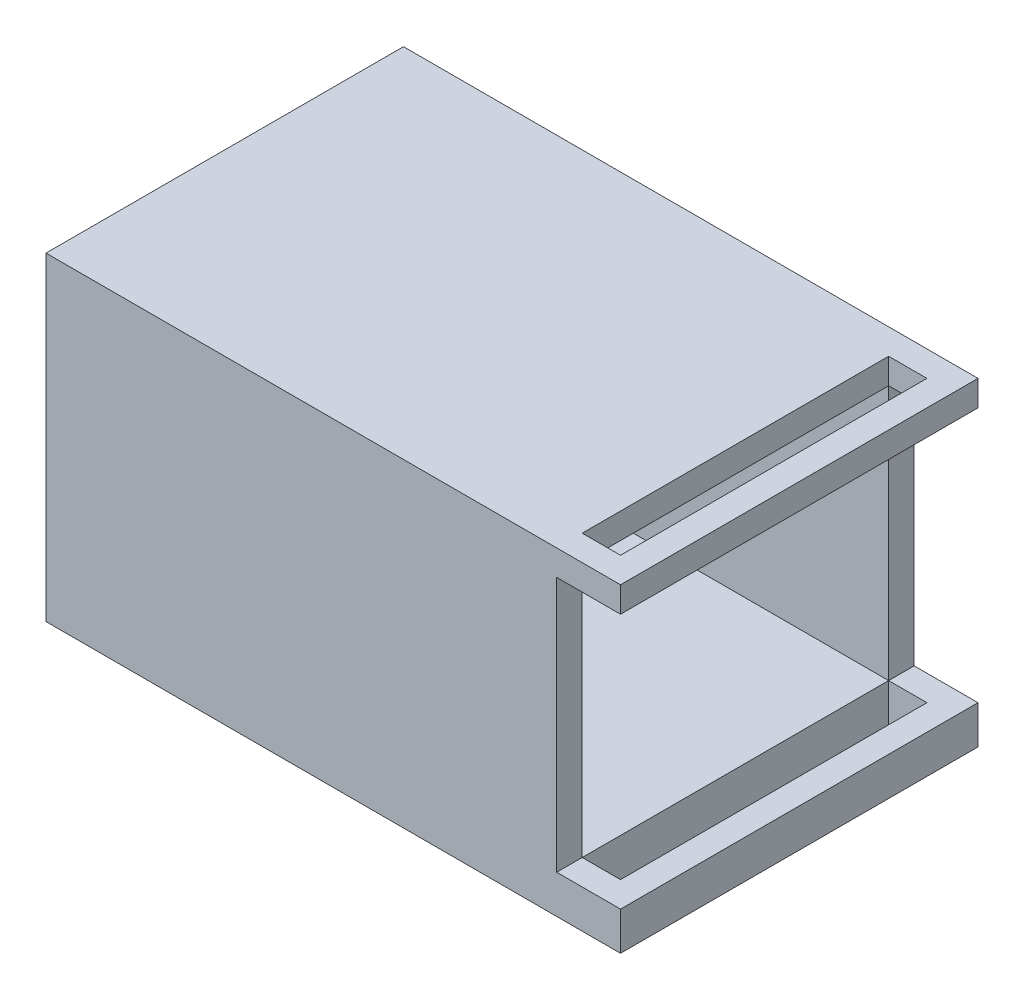
ISO-10303-21;
HEADER;
FILE_DESCRIPTION(('STEP AP214'),'2;1');
FILE_NAME('part.step','',(''),(''),'','','');
FILE_SCHEMA(('AUTOMOTIVE_DESIGN { 1 0 10303 214 1 1 1 1 }'));
ENDSEC;
DATA;
#1=APPLICATION_CONTEXT('core data for automotive mechanical design processes');
#2=APPLICATION_PROTOCOL_DEFINITION('international standard','automotive_design',2000,#1);
#3=PRODUCT_CONTEXT('',#1,'mechanical');
#4=PRODUCT('Part','Part','',(#3));
#5=PRODUCT_RELATED_PRODUCT_CATEGORY('part','',(#4));
#6=PRODUCT_DEFINITION_FORMATION('','',#4);
#7=PRODUCT_DEFINITION_CONTEXT('part definition',#1,'design');
#8=PRODUCT_DEFINITION('design','',#6,#7);
#9=PRODUCT_DEFINITION_SHAPE('','',#8);
#10=(LENGTH_UNIT() NAMED_UNIT(*) SI_UNIT(.MILLI.,.METRE.));
#11=(NAMED_UNIT(*) PLANE_ANGLE_UNIT() SI_UNIT($,.RADIAN.));
#12=(NAMED_UNIT(*) SI_UNIT($,.STERADIAN.) SOLID_ANGLE_UNIT());
#13=UNCERTAINTY_MEASURE_WITH_UNIT(LENGTH_MEASURE(1.E-05),#10,'distance_accuracy_value','');
#14=(GEOMETRIC_REPRESENTATION_CONTEXT(3) GLOBAL_UNCERTAINTY_ASSIGNED_CONTEXT((#13)) GLOBAL_UNIT_ASSIGNED_CONTEXT((#10,
#11,#12)) REPRESENTATION_CONTEXT('',''));
#15=CARTESIAN_POINT('',(0.,0.,0.));
#16=DIRECTION('',(0.,0.,1.));
#17=DIRECTION('',(1.,0.,0.));
#18=AXIS2_PLACEMENT_3D('',#15,#16,#17);
#19=CARTESIAN_POINT('',(0.,3.,0.));
#20=DIRECTION('',(0.,1.,0.));
#21=DIRECTION('',(0.,0.,1.));
#22=AXIS2_PLACEMENT_3D('',#19,#20,#21);
#23=PLANE('',#22);
#24=DIRECTION('',(0.,0.,-1.));
#25=VECTOR('',#24,1.);
#26=CARTESIAN_POINT('',(43.,3.,-2.));
#27=LINE('',#26,#25);
#28=CARTESIAN_POINT('',(43.,3.,-2.));
#29=VERTEX_POINT('',#28);
#30=CARTESIAN_POINT('',(43.,3.,-26.));
#31=VERTEX_POINT('',#30);
#32=EDGE_CURVE('E63',#29,#31,#27,.T.);
#33=ORIENTED_EDGE('',*,*,#32,.F.);
#34=DIRECTION('',(1.,0.,0.));
#35=VECTOR('',#34,1.);
#36=CARTESIAN_POINT('',(43.,3.,-2.));
#37=LINE('',#36,#35);
#38=CARTESIAN_POINT('',(40.,3.,-2.));
#39=VERTEX_POINT('',#38);
#40=EDGE_CURVE('E265',#39,#29,#37,.T.);
#41=ORIENTED_EDGE('',*,*,#40,.F.);
#42=DIRECTION('',(0.,0.,1.));
#43=VECTOR('',#42,1.);
#44=CARTESIAN_POINT('',(40.,3.,-2.));
#45=LINE('',#44,#43);
#46=CARTESIAN_POINT('',(40.,3.,0.));
#47=VERTEX_POINT('',#46);
#48=EDGE_CURVE('E525',#39,#47,#45,.T.);
#49=ORIENTED_EDGE('',*,*,#48,.T.);
#50=DIRECTION('',(1.,0.,0.));
#51=VECTOR('',#50,1.);
#52=CARTESIAN_POINT('',(0.,3.,0.));
#53=LINE('',#52,#51);
#54=CARTESIAN_POINT('',(45.,3.,0.));
#55=VERTEX_POINT('',#54);
#56=EDGE_CURVE('E564',#47,#55,#53,.T.);
#57=ORIENTED_EDGE('',*,*,#56,.T.);
#58=DIRECTION('',(0.,0.,-1.));
#59=VECTOR('',#58,1.);
#60=CARTESIAN_POINT('',(45.,3.,0.));
#61=LINE('',#60,#59);
#62=CARTESIAN_POINT('',(45.,3.,-28.));
#63=VERTEX_POINT('',#62);
#64=EDGE_CURVE('E559',#55,#63,#61,.T.);
#65=ORIENTED_EDGE('',*,*,#64,.T.);
#66=DIRECTION('',(1.,0.,0.));
#67=VECTOR('',#66,1.);
#68=CARTESIAN_POINT('',(0.,3.,-28.));
#69=LINE('',#68,#67);
#70=CARTESIAN_POINT('',(40.,3.,-28.));
#71=VERTEX_POINT('',#70);
#72=EDGE_CURVE('E556',#71,#63,#69,.T.);
#73=ORIENTED_EDGE('',*,*,#72,.F.);
#74=DIRECTION('',(0.,0.,-1.));
#75=VECTOR('',#74,1.);
#76=CARTESIAN_POINT('',(40.,3.,-26.));
#77=LINE('',#76,#75);
#78=CARTESIAN_POINT('',(40.,3.,-26.));
#79=VERTEX_POINT('',#78);
#80=EDGE_CURVE('E529',#79,#71,#77,.T.);
#81=ORIENTED_EDGE('',*,*,#80,.F.);
#82=DIRECTION('',(-1.,0.,0.));
#83=VECTOR('',#82,1.);
#84=CARTESIAN_POINT('',(43.,3.,-26.));
#85=LINE('',#84,#83);
#86=EDGE_CURVE('E278',#31,#79,#85,.T.);
#87=ORIENTED_EDGE('',*,*,#86,.F.);
#88=EDGE_LOOP('',(#33,#41,#49,#57,#65,#73,#81,#87));
#89=FACE_BOUND('',#88,.T.);
#90=ADVANCED_FACE('F47',(#89),#23,.T.);
#91=CARTESIAN_POINT('',(2.,25.,-26.));
#92=DIRECTION('',(1.,0.,0.));
#93=DIRECTION('',(0.,0.,-1.));
#94=AXIS2_PLACEMENT_3D('',#91,#92,#93);
#95=PLANE('',#94);
#96=CARTESIAN_POINT('',(2.,5.25,-17.47));
#97=DIRECTION('',(-1.,0.,0.));
#98=DIRECTION('',(0.,0.,1.));
#99=AXIS2_PLACEMENT_3D('',#96,#97,#98);
#100=CIRCLE('',#99,1.25);
#101=CARTESIAN_POINT('',(2.,5.25,-18.72));
#102=VERTEX_POINT('',#101);
#103=CARTESIAN_POINT('',(2.,4.,-17.47));
#104=VERTEX_POINT('',#103);
#105=EDGE_CURVE('E293',#102,#104,#100,.T.);
#106=ORIENTED_EDGE('',*,*,#105,.T.);
#107=DIRECTION('',(0.,0.,1.));
#108=VECTOR('',#107,1.);
#109=CARTESIAN_POINT('',(2.,4.,-17.47));
#110=LINE('',#109,#108);
#111=CARTESIAN_POINT('',(2.,4.,-10.53));
#112=VERTEX_POINT('',#111);
#113=EDGE_CURVE('E297',#104,#112,#110,.T.);
#114=ORIENTED_EDGE('',*,*,#113,.T.);
#115=CARTESIAN_POINT('',(2.,5.25,-10.53));
#116=DIRECTION('',(-1.,0.,0.));
#117=DIRECTION('',(0.,0.,1.));
#118=AXIS2_PLACEMENT_3D('',#115,#116,#117);
#119=CIRCLE('',#118,1.25);
#120=CARTESIAN_POINT('',(2.,5.25,-9.28));
#121=VERTEX_POINT('',#120);
#122=EDGE_CURVE('E302',#112,#121,#119,.T.);
#123=ORIENTED_EDGE('',*,*,#122,.T.);
#124=DIRECTION('',(0.,1.,0.));
#125=VECTOR('',#124,1.);
#126=CARTESIAN_POINT('',(2.,5.96,-9.28));
#127=LINE('',#126,#125);
#128=CARTESIAN_POINT('',(2.,5.96,-9.28));
#129=VERTEX_POINT('',#128);
#130=EDGE_CURVE('E306',#121,#129,#127,.T.);
#131=ORIENTED_EDGE('',*,*,#130,.T.);
#132=CARTESIAN_POINT('',(2.,5.96,-10.53));
#133=DIRECTION('',(-1.,0.,0.));
#134=DIRECTION('',(0.,0.,1.));
#135=AXIS2_PLACEMENT_3D('',#132,#133,#134);
#136=CIRCLE('',#135,1.25);
#137=CARTESIAN_POINT('',(2.,7.21,-10.53));
#138=VERTEX_POINT('',#137);
#139=EDGE_CURVE('E310',#129,#138,#136,.T.);
#140=ORIENTED_EDGE('',*,*,#139,.T.);
#141=DIRECTION('',(0.,0.,-1.));
#142=VECTOR('',#141,1.);
#143=CARTESIAN_POINT('',(2.,7.21,-17.47));
#144=LINE('',#143,#142);
#145=CARTESIAN_POINT('',(2.,7.21,-17.47));
#146=VERTEX_POINT('',#145);
#147=EDGE_CURVE('E314',#138,#146,#144,.T.);
#148=ORIENTED_EDGE('',*,*,#147,.T.);
#149=CARTESIAN_POINT('',(2.,5.96,-17.47));
#150=DIRECTION('',(-1.,0.,0.));
#151=DIRECTION('',(0.,0.,1.));
#152=AXIS2_PLACEMENT_3D('',#149,#150,#151);
#153=CIRCLE('',#152,1.25);
#154=CARTESIAN_POINT('',(2.,5.96,-18.72));
#155=VERTEX_POINT('',#154);
#156=EDGE_CURVE('E318',#146,#155,#153,.T.);
#157=ORIENTED_EDGE('',*,*,#156,.T.);
#158=DIRECTION('',(0.,-1.,0.));
#159=VECTOR('',#158,1.);
#160=CARTESIAN_POINT('',(2.,5.25,-18.72));
#161=LINE('',#160,#159);
#162=EDGE_CURVE('E322',#155,#102,#161,.T.);
#163=ORIENTED_EDGE('',*,*,#162,.T.);
#164=EDGE_LOOP('',(#106,#114,#123,#131,#140,#148,#157,#163));
#165=FACE_BOUND('',#164,.T.);
#166=DIRECTION('',(0.,-1.,0.));
#167=VECTOR('',#166,1.);
#168=CARTESIAN_POINT('',(2.,12.5,-18.5));
#169=LINE('',#168,#167);
#170=CARTESIAN_POINT('',(2.,12.5,-18.5));
#171=VERTEX_POINT('',#170);
#172=CARTESIAN_POINT('',(2.,8.5,-18.5));
#173=VERTEX_POINT('',#172);
#174=EDGE_CURVE('E401',#171,#173,#169,.T.);
#175=ORIENTED_EDGE('',*,*,#174,.T.);
#176=DIRECTION('',(0.,0.,1.));
#177=VECTOR('',#176,1.);
#178=CARTESIAN_POINT('',(2.,8.5,-18.5));
#179=LINE('',#178,#177);
#180=CARTESIAN_POINT('',(2.,8.5,-9.50000000000001));
#181=VERTEX_POINT('',#180);
#182=EDGE_CURVE('E418',#173,#181,#179,.T.);
#183=ORIENTED_EDGE('',*,*,#182,.T.);
#184=DIRECTION('',(0.,1.,0.));
#185=VECTOR('',#184,1.);
#186=CARTESIAN_POINT('',(2.,12.5,-9.5));
#187=LINE('',#186,#185);
#188=CARTESIAN_POINT('',(2.,12.5,-9.5));
#189=VERTEX_POINT('',#188);
#190=EDGE_CURVE('E414',#181,#189,#187,.T.);
#191=ORIENTED_EDGE('',*,*,#190,.T.);
#192=DIRECTION('',(0.,0.,-1.));
#193=VECTOR('',#192,1.);
#194=CARTESIAN_POINT('',(2.,12.5,-18.5));
#195=LINE('',#194,#193);
#196=EDGE_CURVE('E387',#189,#171,#195,.T.);
#197=ORIENTED_EDGE('',*,*,#196,.T.);
#198=EDGE_LOOP('',(#175,#183,#191,#197));
#199=FACE_BOUND('',#198,.T.);
#200=DIRECTION('',(0.,-1.,0.));
#201=VECTOR('',#200,1.);
#202=CARTESIAN_POINT('',(2.,25.,-26.));
#203=LINE('',#202,#201);
#204=CARTESIAN_POINT('',(2.,23.,-26.));
#205=VERTEX_POINT('',#204);
#206=CARTESIAN_POINT('',(2.,3.,-26.));
#207=VERTEX_POINT('',#206);
#208=EDGE_CURVE('E536',#205,#207,#203,.T.);
#209=ORIENTED_EDGE('',*,*,#208,.F.);
#210=DIRECTION('',(0.,0.,1.));
#211=VECTOR('',#210,1.);
#212=CARTESIAN_POINT('',(2.,23.,-26.));
#213=LINE('',#212,#211);
#214=CARTESIAN_POINT('',(2.,23.,-2.));
#215=VERTEX_POINT('',#214);
#216=EDGE_CURVE('E494',#205,#215,#213,.T.);
#217=ORIENTED_EDGE('',*,*,#216,.T.);
#218=DIRECTION('',(0.,-1.,0.));
#219=VECTOR('',#218,1.);
#220=CARTESIAN_POINT('',(2.,25.,-2.));
#221=LINE('',#220,#219);
#222=CARTESIAN_POINT('',(2.,3.,-2.));
#223=VERTEX_POINT('',#222);
#224=EDGE_CURVE('E517',#215,#223,#221,.T.);
#225=ORIENTED_EDGE('',*,*,#224,.T.);
#226=DIRECTION('',(0.,0.,1.));
#227=VECTOR('',#226,1.);
#228=CARTESIAN_POINT('',(2.,3.,-26.));
#229=LINE('',#228,#227);
#230=EDGE_CURVE('E505',#207,#223,#229,.T.);
#231=ORIENTED_EDGE('',*,*,#230,.F.);
#232=EDGE_LOOP('',(#209,#217,#225,#231));
#233=FACE_BOUND('',#232,.T.);
#234=ADVANCED_FACE('F665',(#165,#199,#233),#95,.T.);
#235=CARTESIAN_POINT('',(2.,25.,-26.));
#236=DIRECTION('',(0.,0.,-1.));
#237=DIRECTION('',(-1.,0.,0.));
#238=AXIS2_PLACEMENT_3D('',#235,#236,#237);
#239=PLANE('',#238);
#240=DIRECTION('',(1.,0.,0.));
#241=VECTOR('',#240,1.);
#242=CARTESIAN_POINT('',(2.,23.,-26.));
#243=LINE('',#242,#241);
#244=CARTESIAN_POINT('',(40.,23.,-26.));
#245=VERTEX_POINT('',#244);
#246=EDGE_CURVE('E497',#205,#245,#243,.T.);
#247=ORIENTED_EDGE('',*,*,#246,.F.);
#248=ORIENTED_EDGE('',*,*,#208,.T.);
#249=DIRECTION('',(1.,0.,0.));
#250=VECTOR('',#249,1.);
#251=CARTESIAN_POINT('',(2.,3.,-26.));
#252=LINE('',#251,#250);
#253=EDGE_CURVE('E510',#207,#79,#252,.T.);
#254=ORIENTED_EDGE('',*,*,#253,.T.);
#255=DIRECTION('',(0.,-1.,0.));
#256=VECTOR('',#255,1.);
#257=CARTESIAN_POINT('',(40.,25.,-26.));
#258=LINE('',#257,#256);
#259=EDGE_CURVE('E540',#245,#79,#258,.T.);
#260=ORIENTED_EDGE('',*,*,#259,.F.);
#261=EDGE_LOOP('',(#247,#248,#254,#260));
#262=FACE_BOUND('',#261,.T.);
#263=ADVANCED_FACE('F627',(#262),#239,.F.);
#264=CARTESIAN_POINT('',(40.,25.,-26.));
#265=DIRECTION('',(-1.,0.,0.));
#266=DIRECTION('',(0.,0.,1.));
#267=AXIS2_PLACEMENT_3D('',#264,#265,#266);
#268=PLANE('',#267);
#269=DIRECTION('',(0.,0.,-1.));
#270=VECTOR('',#269,1.);
#271=CARTESIAN_POINT('',(40.,23.,-26.));
#272=LINE('',#271,#270);
#273=CARTESIAN_POINT('',(40.,23.,-28.));
#274=VERTEX_POINT('',#273);
#275=EDGE_CURVE('E501',#245,#274,#272,.T.);
#276=ORIENTED_EDGE('',*,*,#275,.F.);
#277=ORIENTED_EDGE('',*,*,#259,.T.);
#278=ORIENTED_EDGE('',*,*,#80,.T.);
#279=DIRECTION('',(0.,-1.,0.));
#280=VECTOR('',#279,1.);
#281=CARTESIAN_POINT('',(40.,25.,-28.));
#282=LINE('',#281,#280);
#283=EDGE_CURVE('E544',#274,#71,#282,.T.);
#284=ORIENTED_EDGE('',*,*,#283,.F.);
#285=EDGE_LOOP('',(#276,#277,#278,#284));
#286=FACE_BOUND('',#285,.T.);
#287=ADVANCED_FACE('F624',(#286),#268,.F.);
#288=CARTESIAN_POINT('',(40.,25.,-2.));
#289=DIRECTION('',(1.,0.,0.));
#290=DIRECTION('',(0.,0.,-1.));
#291=AXIS2_PLACEMENT_3D('',#288,#289,#290);
#292=PLANE('',#291);
#293=DIRECTION('',(0.,-1.,0.));
#294=VECTOR('',#293,1.);
#295=CARTESIAN_POINT('',(40.,25.,-2.));
#296=LINE('',#295,#294);
#297=CARTESIAN_POINT('',(40.,23.,-2.));
#298=VERTEX_POINT('',#297);
#299=EDGE_CURVE('E550',#298,#39,#296,.T.);
#300=ORIENTED_EDGE('',*,*,#299,.F.);
#301=DIRECTION('',(0.,0.,1.));
#302=VECTOR('',#301,1.);
#303=CARTESIAN_POINT('',(40.,23.,-2.));
#304=LINE('',#303,#302);
#305=CARTESIAN_POINT('',(40.,23.,0.));
#306=VERTEX_POINT('',#305);
#307=EDGE_CURVE('E488',#298,#306,#304,.T.);
#308=ORIENTED_EDGE('',*,*,#307,.T.);
#309=DIRECTION('',(0.,-1.,0.));
#310=VECTOR('',#309,1.);
#311=CARTESIAN_POINT('',(40.,25.,0.));
#312=LINE('',#311,#310);
#313=EDGE_CURVE('E547',#306,#47,#312,.T.);
#314=ORIENTED_EDGE('',*,*,#313,.T.);
#315=ORIENTED_EDGE('',*,*,#48,.F.);
#316=EDGE_LOOP('',(#300,#308,#314,#315));
#317=FACE_BOUND('',#316,.T.);
#318=ADVANCED_FACE('F682',(#317),#292,.T.);
#319=CARTESIAN_POINT('',(2.,25.,-2.));
#320=DIRECTION('',(0.,0.,-1.));
#321=DIRECTION('',(-1.,0.,0.));
#322=AXIS2_PLACEMENT_3D('',#319,#320,#321);
#323=PLANE('',#322);
#324=ORIENTED_EDGE('',*,*,#224,.F.);
#325=DIRECTION('',(1.,0.,0.));
#326=VECTOR('',#325,1.);
#327=CARTESIAN_POINT('',(2.,23.,-2.));
#328=LINE('',#327,#326);
#329=EDGE_CURVE('E11',#215,#298,#328,.T.);
#330=ORIENTED_EDGE('',*,*,#329,.T.);
#331=ORIENTED_EDGE('',*,*,#299,.T.);
#332=DIRECTION('',(1.,0.,0.));
#333=VECTOR('',#332,1.);
#334=CARTESIAN_POINT('',(2.,3.,-2.));
#335=LINE('',#334,#333);
#336=EDGE_CURVE('E521',#223,#39,#335,.T.);
#337=ORIENTED_EDGE('',*,*,#336,.F.);
#338=EDGE_LOOP('',(#324,#330,#331,#337));
#339=FACE_BOUND('',#338,.T.);
#340=ADVANCED_FACE('F676',(#339),#323,.T.);
#341=DIRECTION('',(0.,0.,1.));
#342=VECTOR('',#341,1.);
#343=CARTESIAN_POINT('',(40.,3.,-2.));
#344=LINE('',#343,#342);
#345=EDGE_CURVE('E269',#79,#39,#344,.T.);
#346=ORIENTED_EDGE('',*,*,#345,.F.);
#347=ORIENTED_EDGE('',*,*,#253,.F.);
#348=ORIENTED_EDGE('',*,*,#230,.T.);
#349=ORIENTED_EDGE('',*,*,#336,.T.);
#350=EDGE_LOOP('',(#346,#347,#348,#349));
#351=FACE_BOUND('',#350,.T.);
#352=ADVANCED_FACE('F667',(#351),#23,.T.);
#353=CARTESIAN_POINT('',(0.,3.,-28.));
#354=DIRECTION('',(0.,0.,-1.));
#355=DIRECTION('',(-1.,0.,0.));
#356=AXIS2_PLACEMENT_3D('',#353,#354,#355);
#357=PLANE('',#356);
#358=DIRECTION('',(-1.,0.,0.));
#359=VECTOR('',#358,1.);
#360=CARTESIAN_POINT('',(0.,23.,-28.));
#361=LINE('',#360,#359);
#362=CARTESIAN_POINT('',(45.,23.,-28.));
#363=VERTEX_POINT('',#362);
#364=EDGE_CURVE('E476',#363,#274,#361,.T.);
#365=ORIENTED_EDGE('',*,*,#364,.T.);
#366=ORIENTED_EDGE('',*,*,#283,.T.);
#367=ORIENTED_EDGE('',*,*,#72,.T.);
#368=DIRECTION('',(0.,-1.,0.));
#369=VECTOR('',#368,1.);
#370=CARTESIAN_POINT('',(45.,3.,-28.));
#371=LINE('',#370,#369);
#372=CARTESIAN_POINT('',(45.,0.,-28.));
#373=VERTEX_POINT('',#372);
#374=EDGE_CURVE('E567',#63,#373,#371,.T.);
#375=ORIENTED_EDGE('',*,*,#374,.T.);
#376=DIRECTION('',(1.,0.,0.));
#377=VECTOR('',#376,1.);
#378=CARTESIAN_POINT('',(0.,0.,-28.));
#379=LINE('',#378,#377);
#380=CARTESIAN_POINT('',(0.,0.,-28.));
#381=VERTEX_POINT('',#380);
#382=EDGE_CURVE('E539',#381,#373,#379,.T.);
#383=ORIENTED_EDGE('',*,*,#382,.F.);
#384=DIRECTION('',(0.,-1.,0.));
#385=VECTOR('',#384,1.);
#386=CARTESIAN_POINT('',(0.,3.,-28.));
#387=LINE('',#386,#385);
#388=CARTESIAN_POINT('',(0.,25.,-28.));
#389=VERTEX_POINT('',#388);
#390=EDGE_CURVE('E56',#389,#381,#387,.T.);
#391=ORIENTED_EDGE('',*,*,#390,.F.);
#392=DIRECTION('',(1.,0.,0.));
#393=VECTOR('',#392,1.);
#394=CARTESIAN_POINT('',(0.,25.,-28.));
#395=LINE('',#394,#393);
#396=CARTESIAN_POINT('',(45.,25.,-28.));
#397=VERTEX_POINT('',#396);
#398=EDGE_CURVE('E514',#389,#397,#395,.T.);
#399=ORIENTED_EDGE('',*,*,#398,.T.);
#400=DIRECTION('',(0.,1.,0.));
#401=VECTOR('',#400,1.);
#402=CARTESIAN_POINT('',(45.,23.,-28.));
#403=LINE('',#402,#401);
#404=EDGE_CURVE('E484',#363,#397,#403,.T.);
#405=ORIENTED_EDGE('',*,*,#404,.F.);
#406=EDGE_LOOP('',(#365,#366,#367,#375,#383,#391,#399,#405));
#407=FACE_BOUND('',#406,.T.);
#408=ADVANCED_FACE('F49',(#407),#357,.T.);
#409=CARTESIAN_POINT('',(0.,3.,0.));
#410=DIRECTION('',(-1.,0.,0.));
#411=DIRECTION('',(0.,0.,1.));
#412=AXIS2_PLACEMENT_3D('',#409,#410,#411);
#413=PLANE('',#412);
#414=CARTESIAN_POINT('',(0.,5.25,-17.47));
#415=DIRECTION('',(-1.,0.,0.));
#416=DIRECTION('',(0.,0.,1.));
#417=AXIS2_PLACEMENT_3D('',#414,#415,#416);
#418=CIRCLE('',#417,1.25);
#419=CARTESIAN_POINT('',(0.,5.25,-18.72));
#420=VERTEX_POINT('',#419);
#421=CARTESIAN_POINT('',(0.,4.,-17.47));
#422=VERTEX_POINT('',#421);
#423=EDGE_CURVE('E327',#420,#422,#418,.T.);
#424=ORIENTED_EDGE('',*,*,#423,.F.);
#425=DIRECTION('',(0.,-1.,0.));
#426=VECTOR('',#425,1.);
#427=CARTESIAN_POINT('',(0.,5.25,-18.72));
#428=LINE('',#427,#426);
#429=CARTESIAN_POINT('',(0.,5.96,-18.72));
#430=VERTEX_POINT('',#429);
#431=EDGE_CURVE('E298',#430,#420,#428,.T.);
#432=ORIENTED_EDGE('',*,*,#431,.F.);
#433=CARTESIAN_POINT('',(0.,5.96,-17.47));
#434=DIRECTION('',(-1.,0.,0.));
#435=DIRECTION('',(0.,0.,1.));
#436=AXIS2_PLACEMENT_3D('',#433,#434,#435);
#437=CIRCLE('',#436,1.25);
#438=CARTESIAN_POINT('',(0.,7.21,-17.47));
#439=VERTEX_POINT('',#438);
#440=EDGE_CURVE('E351',#439,#430,#437,.T.);
#441=ORIENTED_EDGE('',*,*,#440,.F.);
#442=DIRECTION('',(0.,0.,-1.));
#443=VECTOR('',#442,1.);
#444=CARTESIAN_POINT('',(0.,7.21,-17.47));
#445=LINE('',#444,#443);
#446=CARTESIAN_POINT('',(0.,7.21,-10.53));
#447=VERTEX_POINT('',#446);
#448=EDGE_CURVE('E347',#447,#439,#445,.T.);
#449=ORIENTED_EDGE('',*,*,#448,.F.);
#450=CARTESIAN_POINT('',(0.,5.96,-10.53));
#451=DIRECTION('',(-1.,0.,0.));
#452=DIRECTION('',(0.,0.,1.));
#453=AXIS2_PLACEMENT_3D('',#450,#451,#452);
#454=CIRCLE('',#453,1.25);
#455=CARTESIAN_POINT('',(0.,5.96,-9.28));
#456=VERTEX_POINT('',#455);
#457=EDGE_CURVE('E343',#456,#447,#454,.T.);
#458=ORIENTED_EDGE('',*,*,#457,.F.);
#459=DIRECTION('',(0.,1.,0.));
#460=VECTOR('',#459,1.);
#461=CARTESIAN_POINT('',(0.,5.96,-9.28));
#462=LINE('',#461,#460);
#463=CARTESIAN_POINT('',(0.,5.25,-9.28));
#464=VERTEX_POINT('',#463);
#465=EDGE_CURVE('E339',#464,#456,#462,.T.);
#466=ORIENTED_EDGE('',*,*,#465,.F.);
#467=CARTESIAN_POINT('',(0.,5.25,-10.53));
#468=DIRECTION('',(-1.,0.,0.));
#469=DIRECTION('',(0.,0.,1.));
#470=AXIS2_PLACEMENT_3D('',#467,#468,#469);
#471=CIRCLE('',#470,1.25);
#472=CARTESIAN_POINT('',(0.,4.,-10.53));
#473=VERTEX_POINT('',#472);
#474=EDGE_CURVE('E335',#473,#464,#471,.T.);
#475=ORIENTED_EDGE('',*,*,#474,.F.);
#476=DIRECTION('',(0.,0.,1.));
#477=VECTOR('',#476,1.);
#478=CARTESIAN_POINT('',(0.,4.,-17.47));
#479=LINE('',#478,#477);
#480=EDGE_CURVE('E330',#422,#473,#479,.T.);
#481=ORIENTED_EDGE('',*,*,#480,.F.);
#482=EDGE_LOOP('',(#424,#432,#441,#449,#458,#466,#475,#481));
#483=FACE_BOUND('',#482,.T.);
#484=DIRECTION('',(0.,-1.,0.));
#485=VECTOR('',#484,1.);
#486=CARTESIAN_POINT('',(0.,12.5,-18.5));
#487=LINE('',#486,#485);
#488=CARTESIAN_POINT('',(0.,12.5,-18.5));
#489=VERTEX_POINT('',#488);
#490=CARTESIAN_POINT('',(0.,8.5,-18.5));
#491=VERTEX_POINT('',#490);
#492=EDGE_CURVE('E331',#489,#491,#487,.T.);
#493=ORIENTED_EDGE('',*,*,#492,.F.);
#494=DIRECTION('',(0.,0.,-1.));
#495=VECTOR('',#494,1.);
#496=CARTESIAN_POINT('',(0.,12.5,-18.5));
#497=LINE('',#496,#495);
#498=CARTESIAN_POINT('',(0.,12.5,-9.5));
#499=VERTEX_POINT('',#498);
#500=EDGE_CURVE('E396',#499,#489,#497,.T.);
#501=ORIENTED_EDGE('',*,*,#500,.F.);
#502=DIRECTION('',(0.,1.,0.));
#503=VECTOR('',#502,1.);
#504=CARTESIAN_POINT('',(0.,12.5,-9.5));
#505=LINE('',#504,#503);
#506=CARTESIAN_POINT('',(0.,8.5,-9.5));
#507=VERTEX_POINT('',#506);
#508=EDGE_CURVE('E400',#507,#499,#505,.T.);
#509=ORIENTED_EDGE('',*,*,#508,.F.);
#510=DIRECTION('',(0.,0.,1.));
#511=VECTOR('',#510,1.);
#512=CARTESIAN_POINT('',(0.,8.5,-18.5));
#513=LINE('',#512,#511);
#514=EDGE_CURVE('E405',#491,#507,#513,.T.);
#515=ORIENTED_EDGE('',*,*,#514,.F.);
#516=EDGE_LOOP('',(#493,#501,#509,#515));
#517=FACE_BOUND('',#516,.T.);
#518=ORIENTED_EDGE('',*,*,#390,.T.);
#519=DIRECTION('',(0.,0.,-1.));
#520=VECTOR('',#519,1.);
#521=CARTESIAN_POINT('',(0.,0.,0.));
#522=LINE('',#521,#520);
#523=CARTESIAN_POINT('',(0.,0.,0.));
#524=VERTEX_POINT('',#523);
#525=EDGE_CURVE('E560',#524,#381,#522,.T.);
#526=ORIENTED_EDGE('',*,*,#525,.F.);
#527=DIRECTION('',(0.,-1.,0.));
#528=VECTOR('',#527,1.);
#529=CARTESIAN_POINT('',(0.,3.,0.));
#530=LINE('',#529,#528);
#531=CARTESIAN_POINT('',(0.,25.,0.));
#532=VERTEX_POINT('',#531);
#533=EDGE_CURVE('E583',#532,#524,#530,.T.);
#534=ORIENTED_EDGE('',*,*,#533,.F.);
#535=DIRECTION('',(0.,0.,1.));
#536=VECTOR('',#535,1.);
#537=CARTESIAN_POINT('',(0.,25.,-28.));
#538=LINE('',#537,#536);
#539=EDGE_CURVE('E509',#389,#532,#538,.T.);
#540=ORIENTED_EDGE('',*,*,#539,.F.);
#541=EDGE_LOOP('',(#518,#526,#534,#540));
#542=FACE_BOUND('',#541,.T.);
#543=ADVANCED_FACE('F602',(#483,#517,#542),#413,.T.);
#544=CARTESIAN_POINT('',(0.,3.,0.));
#545=DIRECTION('',(0.,0.,-1.));
#546=DIRECTION('',(-1.,0.,0.));
#547=AXIS2_PLACEMENT_3D('',#544,#545,#546);
#548=PLANE('',#547);
#549=ORIENTED_EDGE('',*,*,#533,.T.);
#550=DIRECTION('',(1.,0.,0.));
#551=VECTOR('',#550,1.);
#552=CARTESIAN_POINT('',(0.,0.,0.));
#553=LINE('',#552,#551);
#554=CARTESIAN_POINT('',(45.,0.,0.));
#555=VERTEX_POINT('',#554);
#556=EDGE_CURVE('E575',#524,#555,#553,.T.);
#557=ORIENTED_EDGE('',*,*,#556,.T.);
#558=DIRECTION('',(0.,-1.,0.));
#559=VECTOR('',#558,1.);
#560=CARTESIAN_POINT('',(45.,3.,0.));
#561=LINE('',#560,#559);
#562=EDGE_CURVE('E586',#55,#555,#561,.T.);
#563=ORIENTED_EDGE('',*,*,#562,.F.);
#564=ORIENTED_EDGE('',*,*,#56,.F.);
#565=ORIENTED_EDGE('',*,*,#313,.F.);
#566=DIRECTION('',(1.,0.,0.));
#567=VECTOR('',#566,1.);
#568=CARTESIAN_POINT('',(0.,23.,0.));
#569=LINE('',#568,#567);
#570=CARTESIAN_POINT('',(45.,23.,0.));
#571=VERTEX_POINT('',#570);
#572=EDGE_CURVE('E469',#306,#571,#569,.T.);
#573=ORIENTED_EDGE('',*,*,#572,.T.);
#574=DIRECTION('',(0.,1.,0.));
#575=VECTOR('',#574,1.);
#576=CARTESIAN_POINT('',(45.,23.,0.));
#577=LINE('',#576,#575);
#578=CARTESIAN_POINT('',(45.,25.,0.));
#579=VERTEX_POINT('',#578);
#580=EDGE_CURVE('E480',#571,#579,#577,.T.);
#581=ORIENTED_EDGE('',*,*,#580,.T.);
#582=DIRECTION('',(1.,0.,0.));
#583=VECTOR('',#582,1.);
#584=CARTESIAN_POINT('',(0.,25.,0.));
#585=LINE('',#584,#583);
#586=EDGE_CURVE('E506',#532,#579,#585,.T.);
#587=ORIENTED_EDGE('',*,*,#586,.F.);
#588=EDGE_LOOP('',(#549,#557,#563,#564,#565,#573,#581,#587));
#589=FACE_BOUND('',#588,.T.);
#590=ADVANCED_FACE('F615',(#589),#548,.F.);
#591=CARTESIAN_POINT('',(45.,3.,0.));
#592=DIRECTION('',(-1.,0.,0.));
#593=DIRECTION('',(0.,0.,1.));
#594=AXIS2_PLACEMENT_3D('',#591,#592,#593);
#595=PLANE('',#594);
#596=DIRECTION('',(0.,0.,-1.));
#597=VECTOR('',#596,1.);
#598=CARTESIAN_POINT('',(45.,0.,0.));
#599=LINE('',#598,#597);
#600=EDGE_CURVE('E571',#555,#373,#599,.T.);
#601=ORIENTED_EDGE('',*,*,#600,.T.);
#602=ORIENTED_EDGE('',*,*,#374,.F.);
#603=ORIENTED_EDGE('',*,*,#64,.F.);
#604=ORIENTED_EDGE('',*,*,#562,.T.);
#605=EDGE_LOOP('',(#601,#602,#603,#604));
#606=FACE_BOUND('',#605,.T.);
#607=ADVANCED_FACE('F597',(#606),#595,.F.);
#608=CARTESIAN_POINT('',(0.,0.,0.));
#609=DIRECTION('',(0.,1.,0.));
#610=DIRECTION('',(0.,0.,1.));
#611=AXIS2_PLACEMENT_3D('',#608,#609,#610);
#612=PLANE('',#611);
#613=DIRECTION('',(1.,0.,0.));
#614=VECTOR('',#613,1.);
#615=CARTESIAN_POINT('',(43.,0.,-2.));
#616=LINE('',#615,#614);
#617=CARTESIAN_POINT('',(40.,0.,-2.));
#618=VERTEX_POINT('',#617);
#619=CARTESIAN_POINT('',(43.,0.,-2.));
#620=VERTEX_POINT('',#619);
#621=EDGE_CURVE('E253',#618,#620,#616,.T.);
#622=ORIENTED_EDGE('',*,*,#621,.T.);
#623=DIRECTION('',(0.,0.,-1.));
#624=VECTOR('',#623,1.);
#625=CARTESIAN_POINT('',(43.,0.,-2.));
#626=LINE('',#625,#624);
#627=CARTESIAN_POINT('',(43.,0.,-26.));
#628=VERTEX_POINT('',#627);
#629=EDGE_CURVE('E246',#620,#628,#626,.T.);
#630=ORIENTED_EDGE('',*,*,#629,.T.);
#631=DIRECTION('',(-1.,0.,0.));
#632=VECTOR('',#631,1.);
#633=CARTESIAN_POINT('',(43.,0.,-26.));
#634=LINE('',#633,#632);
#635=CARTESIAN_POINT('',(40.,0.,-26.));
#636=VERTEX_POINT('',#635);
#637=EDGE_CURVE('E256',#628,#636,#634,.T.);
#638=ORIENTED_EDGE('',*,*,#637,.T.);
#639=DIRECTION('',(0.,0.,1.));
#640=VECTOR('',#639,1.);
#641=CARTESIAN_POINT('',(40.,0.,-2.));
#642=LINE('',#641,#640);
#643=EDGE_CURVE('E71',#636,#618,#642,.T.);
#644=ORIENTED_EDGE('',*,*,#643,.T.);
#645=EDGE_LOOP('',(#622,#630,#638,#644));
#646=FACE_BOUND('',#645,.T.);
#647=ORIENTED_EDGE('',*,*,#382,.T.);
#648=ORIENTED_EDGE('',*,*,#600,.F.);
#649=ORIENTED_EDGE('',*,*,#556,.F.);
#650=ORIENTED_EDGE('',*,*,#525,.T.);
#651=EDGE_LOOP('',(#647,#648,#649,#650));
#652=FACE_BOUND('',#651,.T.);
#653=ADVANCED_FACE('F261',(#646,#652),#612,.F.);
#654=CARTESIAN_POINT('',(0.,25.,0.));
#655=DIRECTION('',(0.,1.,0.));
#656=DIRECTION('',(0.,0.,1.));
#657=AXIS2_PLACEMENT_3D('',#654,#655,#656);
#658=PLANE('',#657);
#659=DIRECTION('',(0.,0.,1.));
#660=VECTOR('',#659,1.);
#661=CARTESIAN_POINT('',(40.,25.,-26.));
#662=LINE('',#661,#660);
#663=CARTESIAN_POINT('',(40.,25.,-26.));
#664=VERTEX_POINT('',#663);
#665=CARTESIAN_POINT('',(40.,25.,-2.));
#666=VERTEX_POINT('',#665);
#667=EDGE_CURVE('E361',#664,#666,#662,.T.);
#668=ORIENTED_EDGE('',*,*,#667,.F.);
#669=DIRECTION('',(-1.,0.,0.));
#670=VECTOR('',#669,1.);
#671=CARTESIAN_POINT('',(40.,25.,-26.));
#672=LINE('',#671,#670);
#673=CARTESIAN_POINT('',(43.,25.,-26.));
#674=VERTEX_POINT('',#673);
#675=EDGE_CURVE('E430',#674,#664,#672,.T.);
#676=ORIENTED_EDGE('',*,*,#675,.F.);
#677=DIRECTION('',(0.,0.,-1.));
#678=VECTOR('',#677,1.);
#679=CARTESIAN_POINT('',(43.,25.,-26.));
#680=LINE('',#679,#678);
#681=CARTESIAN_POINT('',(43.,25.,-2.));
#682=VERTEX_POINT('',#681);
#683=EDGE_CURVE('E449',#682,#674,#680,.T.);
#684=ORIENTED_EDGE('',*,*,#683,.F.);
#685=DIRECTION('',(1.,0.,0.));
#686=VECTOR('',#685,1.);
#687=CARTESIAN_POINT('',(40.,25.,-2.));
#688=LINE('',#687,#686);
#689=EDGE_CURVE('E445',#666,#682,#688,.T.);
#690=ORIENTED_EDGE('',*,*,#689,.F.);
#691=EDGE_LOOP('',(#668,#676,#684,#690));
#692=FACE_BOUND('',#691,.T.);
#693=DIRECTION('',(0.,0.,-1.));
#694=VECTOR('',#693,1.);
#695=CARTESIAN_POINT('',(45.,25.,-28.));
#696=LINE('',#695,#694);
#697=EDGE_CURVE('E459',#579,#397,#696,.T.);
#698=ORIENTED_EDGE('',*,*,#697,.T.);
#699=ORIENTED_EDGE('',*,*,#398,.F.);
#700=ORIENTED_EDGE('',*,*,#539,.T.);
#701=ORIENTED_EDGE('',*,*,#586,.T.);
#702=EDGE_LOOP('',(#698,#699,#700,#701));
#703=FACE_BOUND('',#702,.T.);
#704=ADVANCED_FACE('F612',(#692,#703),#658,.T.);
#705=CARTESIAN_POINT('',(0.,23.,0.));
#706=DIRECTION('',(0.,1.,0.));
#707=DIRECTION('',(0.,0.,1.));
#708=AXIS2_PLACEMENT_3D('',#705,#706,#707);
#709=PLANE('',#708);
#710=DIRECTION('',(-1.,0.,0.));
#711=VECTOR('',#710,1.);
#712=CARTESIAN_POINT('',(40.,23.,-26.));
#713=LINE('',#712,#711);
#714=CARTESIAN_POINT('',(43.,23.,-26.));
#715=VERTEX_POINT('',#714);
#716=EDGE_CURVE('E438',#715,#245,#713,.T.);
#717=ORIENTED_EDGE('',*,*,#716,.T.);
#718=ORIENTED_EDGE('',*,*,#275,.T.);
#719=ORIENTED_EDGE('',*,*,#364,.F.);
#720=DIRECTION('',(0.,0.,-1.));
#721=VECTOR('',#720,1.);
#722=CARTESIAN_POINT('',(45.,23.,-28.));
#723=LINE('',#722,#721);
#724=EDGE_CURVE('E472',#571,#363,#723,.T.);
#725=ORIENTED_EDGE('',*,*,#724,.F.);
#726=ORIENTED_EDGE('',*,*,#572,.F.);
#727=ORIENTED_EDGE('',*,*,#307,.F.);
#728=DIRECTION('',(1.,0.,0.));
#729=VECTOR('',#728,1.);
#730=CARTESIAN_POINT('',(40.,23.,-2.));
#731=LINE('',#730,#729);
#732=CARTESIAN_POINT('',(43.,23.,-2.));
#733=VERTEX_POINT('',#732);
#734=EDGE_CURVE('E429',#298,#733,#731,.T.);
#735=ORIENTED_EDGE('',*,*,#734,.T.);
#736=DIRECTION('',(0.,0.,-1.));
#737=VECTOR('',#736,1.);
#738=CARTESIAN_POINT('',(43.,23.,-26.));
#739=LINE('',#738,#737);
#740=EDGE_CURVE('E434',#733,#715,#739,.T.);
#741=ORIENTED_EDGE('',*,*,#740,.T.);
#742=EDGE_LOOP('',(#717,#718,#719,#725,#726,#727,#735,#741));
#743=FACE_BOUND('',#742,.T.);
#744=ADVANCED_FACE('F619',(#743),#709,.F.);
#745=ORIENTED_EDGE('',*,*,#216,.F.);
#746=ORIENTED_EDGE('',*,*,#246,.T.);
#747=DIRECTION('',(0.,0.,1.));
#748=VECTOR('',#747,1.);
#749=CARTESIAN_POINT('',(40.,23.,-26.));
#750=LINE('',#749,#748);
#751=EDGE_CURVE('E425',#245,#298,#750,.T.);
#752=ORIENTED_EDGE('',*,*,#751,.T.);
#753=ORIENTED_EDGE('',*,*,#329,.F.);
#754=EDGE_LOOP('',(#745,#746,#752,#753));
#755=FACE_BOUND('',#754,.T.);
#756=ADVANCED_FACE('F633',(#755),#709,.F.);
#757=CARTESIAN_POINT('',(45.,23.,-28.));
#758=DIRECTION('',(1.,0.,0.));
#759=DIRECTION('',(0.,0.,-1.));
#760=AXIS2_PLACEMENT_3D('',#757,#758,#759);
#761=PLANE('',#760);
#762=ORIENTED_EDGE('',*,*,#697,.F.);
#763=ORIENTED_EDGE('',*,*,#580,.F.);
#764=ORIENTED_EDGE('',*,*,#724,.T.);
#765=ORIENTED_EDGE('',*,*,#404,.T.);
#766=EDGE_LOOP('',(#762,#763,#764,#765));
#767=FACE_BOUND('',#766,.T.);
#768=ADVANCED_FACE('F608',(#767),#761,.T.);
#769=CARTESIAN_POINT('',(40.,23.,-26.));
#770=DIRECTION('',(-1.,0.,0.));
#771=DIRECTION('',(0.,0.,1.));
#772=AXIS2_PLACEMENT_3D('',#769,#770,#771);
#773=PLANE('',#772);
#774=ORIENTED_EDGE('',*,*,#667,.T.);
#775=DIRECTION('',(0.,1.,0.));
#776=VECTOR('',#775,1.);
#777=CARTESIAN_POINT('',(40.,23.,-2.));
#778=LINE('',#777,#776);
#779=EDGE_CURVE('E442',#298,#666,#778,.T.);
#780=ORIENTED_EDGE('',*,*,#779,.F.);
#781=ORIENTED_EDGE('',*,*,#751,.F.);
#782=DIRECTION('',(0.,1.,0.));
#783=VECTOR('',#782,1.);
#784=CARTESIAN_POINT('',(40.,23.,-26.));
#785=LINE('',#784,#783);
#786=EDGE_CURVE('E456',#245,#664,#785,.T.);
#787=ORIENTED_EDGE('',*,*,#786,.T.);
#788=EDGE_LOOP('',(#774,#780,#781,#787));
#789=FACE_BOUND('',#788,.T.);
#790=ADVANCED_FACE('F643',(#789),#773,.F.);
#791=CARTESIAN_POINT('',(40.,23.,-26.));
#792=DIRECTION('',(0.,0.,-1.));
#793=DIRECTION('',(-1.,0.,0.));
#794=AXIS2_PLACEMENT_3D('',#791,#792,#793);
#795=PLANE('',#794);
#796=ORIENTED_EDGE('',*,*,#675,.T.);
#797=ORIENTED_EDGE('',*,*,#786,.F.);
#798=ORIENTED_EDGE('',*,*,#716,.F.);
#799=DIRECTION('',(0.,1.,0.));
#800=VECTOR('',#799,1.);
#801=CARTESIAN_POINT('',(43.,23.,-26.));
#802=LINE('',#801,#800);
#803=EDGE_CURVE('E460',#715,#674,#802,.T.);
#804=ORIENTED_EDGE('',*,*,#803,.T.);
#805=EDGE_LOOP('',(#796,#797,#798,#804));
#806=FACE_BOUND('',#805,.T.);
#807=ADVANCED_FACE('F638',(#806),#795,.F.);
#808=CARTESIAN_POINT('',(43.,23.,-26.));
#809=DIRECTION('',(1.,0.,0.));
#810=DIRECTION('',(0.,0.,-1.));
#811=AXIS2_PLACEMENT_3D('',#808,#809,#810);
#812=PLANE('',#811);
#813=ORIENTED_EDGE('',*,*,#683,.T.);
#814=ORIENTED_EDGE('',*,*,#803,.F.);
#815=ORIENTED_EDGE('',*,*,#740,.F.);
#816=DIRECTION('',(0.,1.,0.));
#817=VECTOR('',#816,1.);
#818=CARTESIAN_POINT('',(43.,23.,-2.));
#819=LINE('',#818,#817);
#820=EDGE_CURVE('E463',#733,#682,#819,.T.);
#821=ORIENTED_EDGE('',*,*,#820,.T.);
#822=EDGE_LOOP('',(#813,#814,#815,#821));
#823=FACE_BOUND('',#822,.T.);
#824=ADVANCED_FACE('F647',(#823),#812,.F.);
#825=CARTESIAN_POINT('',(40.,23.,-2.));
#826=DIRECTION('',(0.,0.,1.));
#827=DIRECTION('',(1.,0.,0.));
#828=AXIS2_PLACEMENT_3D('',#825,#826,#827);
#829=PLANE('',#828);
#830=ORIENTED_EDGE('',*,*,#689,.T.);
#831=ORIENTED_EDGE('',*,*,#820,.F.);
#832=ORIENTED_EDGE('',*,*,#734,.F.);
#833=ORIENTED_EDGE('',*,*,#779,.T.);
#834=EDGE_LOOP('',(#830,#831,#832,#833));
#835=FACE_BOUND('',#834,.T.);
#836=ADVANCED_FACE('F649',(#835),#829,.F.);
#837=CARTESIAN_POINT('',(2.,12.5,-18.5));
#838=DIRECTION('',(0.,0.,-1.));
#839=DIRECTION('',(-1.,0.,0.));
#840=AXIS2_PLACEMENT_3D('',#837,#838,#839);
#841=PLANE('',#840);
#842=ORIENTED_EDGE('',*,*,#492,.T.);
#843=DIRECTION('',(-1.,0.,0.));
#844=VECTOR('',#843,1.);
#845=CARTESIAN_POINT('',(2.,8.5,-18.5));
#846=LINE('',#845,#844);
#847=EDGE_CURVE('E383',#173,#491,#846,.T.);
#848=ORIENTED_EDGE('',*,*,#847,.F.);
#849=ORIENTED_EDGE('',*,*,#174,.F.);
#850=DIRECTION('',(-1.,0.,0.));
#851=VECTOR('',#850,1.);
#852=CARTESIAN_POINT('',(2.,12.5,-18.5));
#853=LINE('',#852,#851);
#854=EDGE_CURVE('E287',#171,#489,#853,.T.);
#855=ORIENTED_EDGE('',*,*,#854,.T.);
#856=EDGE_LOOP('',(#842,#848,#849,#855));
#857=FACE_BOUND('',#856,.T.);
#858=ADVANCED_FACE('F833',(#857),#841,.F.);
#859=CARTESIAN_POINT('',(2.,12.5,-18.5));
#860=DIRECTION('',(0.,1.,0.));
#861=DIRECTION('',(0.,0.,1.));
#862=AXIS2_PLACEMENT_3D('',#859,#860,#861);
#863=PLANE('',#862);
#864=ORIENTED_EDGE('',*,*,#500,.T.);
#865=ORIENTED_EDGE('',*,*,#854,.F.);
#866=ORIENTED_EDGE('',*,*,#196,.F.);
#867=DIRECTION('',(-1.,0.,0.));
#868=VECTOR('',#867,1.);
#869=CARTESIAN_POINT('',(2.,12.5,-9.5));
#870=LINE('',#869,#868);
#871=EDGE_CURVE('E391',#189,#499,#870,.T.);
#872=ORIENTED_EDGE('',*,*,#871,.T.);
#873=EDGE_LOOP('',(#864,#865,#866,#872));
#874=FACE_BOUND('',#873,.T.);
#875=ADVANCED_FACE('F841',(#874),#863,.F.);
#876=CARTESIAN_POINT('',(2.,12.5,-9.5));
#877=DIRECTION('',(0.,0.,1.));
#878=DIRECTION('',(1.,0.,0.));
#879=AXIS2_PLACEMENT_3D('',#876,#877,#878);
#880=PLANE('',#879);
#881=ORIENTED_EDGE('',*,*,#508,.T.);
#882=ORIENTED_EDGE('',*,*,#871,.F.);
#883=ORIENTED_EDGE('',*,*,#190,.F.);
#884=DIRECTION('',(-1.,0.,0.));
#885=VECTOR('',#884,1.);
#886=CARTESIAN_POINT('',(2.,8.5,-9.5));
#887=LINE('',#886,#885);
#888=EDGE_CURVE('E388',#181,#507,#887,.T.);
#889=ORIENTED_EDGE('',*,*,#888,.T.);
#890=EDGE_LOOP('',(#881,#882,#883,#889));
#891=FACE_BOUND('',#890,.T.);
#892=ADVANCED_FACE('F851',(#891),#880,.F.);
#893=CARTESIAN_POINT('',(2.,8.5,-18.5));
#894=DIRECTION('',(0.,-1.,0.));
#895=DIRECTION('',(0.,0.,-1.));
#896=AXIS2_PLACEMENT_3D('',#893,#894,#895);
#897=PLANE('',#896);
#898=ORIENTED_EDGE('',*,*,#514,.T.);
#899=ORIENTED_EDGE('',*,*,#888,.F.);
#900=ORIENTED_EDGE('',*,*,#182,.F.);
#901=ORIENTED_EDGE('',*,*,#847,.T.);
#902=EDGE_LOOP('',(#898,#899,#900,#901));
#903=FACE_BOUND('',#902,.T.);
#904=ADVANCED_FACE('F861',(#903),#897,.F.);
#905=CARTESIAN_POINT('',(2.,5.25,-17.47));
#906=DIRECTION('',(-1.,0.,0.));
#907=DIRECTION('',(0.,0.,1.));
#908=AXIS2_PLACEMENT_3D('',#905,#906,#907);
#909=CYLINDRICAL_SURFACE('',#908,1.25);
#910=ORIENTED_EDGE('',*,*,#423,.T.);
#911=DIRECTION('',(-1.,0.,0.));
#912=VECTOR('',#911,1.);
#913=CARTESIAN_POINT('',(2.,4.,-17.47));
#914=LINE('',#913,#912);
#915=EDGE_CURVE('E326',#104,#422,#914,.T.);
#916=ORIENTED_EDGE('',*,*,#915,.F.);
#917=ORIENTED_EDGE('',*,*,#105,.F.);
#918=DIRECTION('',(-1.,0.,0.));
#919=VECTOR('',#918,1.);
#920=CARTESIAN_POINT('',(2.,5.25,-18.72));
#921=LINE('',#920,#919);
#922=EDGE_CURVE('E358',#102,#420,#921,.T.);
#923=ORIENTED_EDGE('',*,*,#922,.T.);
#924=EDGE_LOOP('',(#910,#916,#917,#923));
#925=FACE_BOUND('',#924,.T.);
#926=ADVANCED_FACE('F871',(#925),#909,.F.);
#927=CARTESIAN_POINT('',(2.,5.25,-18.72));
#928=DIRECTION('',(0.,0.,-1.));
#929=DIRECTION('',(-1.,0.,0.));
#930=AXIS2_PLACEMENT_3D('',#927,#928,#929);
#931=PLANE('',#930);
#932=ORIENTED_EDGE('',*,*,#431,.T.);
#933=ORIENTED_EDGE('',*,*,#922,.F.);
#934=ORIENTED_EDGE('',*,*,#162,.F.);
#935=DIRECTION('',(-1.,0.,0.));
#936=VECTOR('',#935,1.);
#937=CARTESIAN_POINT('',(2.,5.96,-18.72));
#938=LINE('',#937,#936);
#939=EDGE_CURVE('E362',#155,#430,#938,.T.);
#940=ORIENTED_EDGE('',*,*,#939,.T.);
#941=EDGE_LOOP('',(#932,#933,#934,#940));
#942=FACE_BOUND('',#941,.T.);
#943=ADVANCED_FACE('F881',(#942),#931,.F.);
#944=CARTESIAN_POINT('',(2.,5.96,-17.47));
#945=DIRECTION('',(-1.,0.,0.));
#946=DIRECTION('',(0.,0.,1.));
#947=AXIS2_PLACEMENT_3D('',#944,#945,#946);
#948=CYLINDRICAL_SURFACE('',#947,1.25);
#949=ORIENTED_EDGE('',*,*,#440,.T.);
#950=ORIENTED_EDGE('',*,*,#939,.F.);
#951=ORIENTED_EDGE('',*,*,#156,.F.);
#952=DIRECTION('',(-1.,0.,0.));
#953=VECTOR('',#952,1.);
#954=CARTESIAN_POINT('',(2.,7.21,-17.47));
#955=LINE('',#954,#953);
#956=EDGE_CURVE('E365',#146,#439,#955,.T.);
#957=ORIENTED_EDGE('',*,*,#956,.T.);
#958=EDGE_LOOP('',(#949,#950,#951,#957));
#959=FACE_BOUND('',#958,.T.);
#960=ADVANCED_FACE('F891',(#959),#948,.F.);
#961=CARTESIAN_POINT('',(2.,7.21,-17.47));
#962=DIRECTION('',(0.,1.,0.));
#963=DIRECTION('',(0.,0.,1.));
#964=AXIS2_PLACEMENT_3D('',#961,#962,#963);
#965=PLANE('',#964);
#966=ORIENTED_EDGE('',*,*,#448,.T.);
#967=ORIENTED_EDGE('',*,*,#956,.F.);
#968=ORIENTED_EDGE('',*,*,#147,.F.);
#969=DIRECTION('',(-1.,0.,0.));
#970=VECTOR('',#969,1.);
#971=CARTESIAN_POINT('',(2.,7.21,-10.53));
#972=LINE('',#971,#970);
#973=EDGE_CURVE('E368',#138,#447,#972,.T.);
#974=ORIENTED_EDGE('',*,*,#973,.T.);
#975=EDGE_LOOP('',(#966,#967,#968,#974));
#976=FACE_BOUND('',#975,.T.);
#977=ADVANCED_FACE('F901',(#976),#965,.F.);
#978=CARTESIAN_POINT('',(2.,5.96,-10.53));
#979=DIRECTION('',(-1.,0.,0.));
#980=DIRECTION('',(0.,0.,1.));
#981=AXIS2_PLACEMENT_3D('',#978,#979,#980);
#982=CYLINDRICAL_SURFACE('',#981,1.25);
#983=ORIENTED_EDGE('',*,*,#457,.T.);
#984=ORIENTED_EDGE('',*,*,#973,.F.);
#985=ORIENTED_EDGE('',*,*,#139,.F.);
#986=DIRECTION('',(-1.,0.,0.));
#987=VECTOR('',#986,1.);
#988=CARTESIAN_POINT('',(2.,5.96,-9.28));
#989=LINE('',#988,#987);
#990=EDGE_CURVE('E371',#129,#456,#989,.T.);
#991=ORIENTED_EDGE('',*,*,#990,.T.);
#992=EDGE_LOOP('',(#983,#984,#985,#991));
#993=FACE_BOUND('',#992,.T.);
#994=ADVANCED_FACE('F911',(#993),#982,.F.);
#995=CARTESIAN_POINT('',(2.,5.96,-9.28));
#996=DIRECTION('',(0.,0.,1.));
#997=DIRECTION('',(0.,-1.,0.));
#998=AXIS2_PLACEMENT_3D('',#995,#996,#997);
#999=PLANE('',#998);
#1000=ORIENTED_EDGE('',*,*,#465,.T.);
#1001=ORIENTED_EDGE('',*,*,#990,.F.);
#1002=ORIENTED_EDGE('',*,*,#130,.F.);
#1003=DIRECTION('',(-1.,0.,0.));
#1004=VECTOR('',#1003,1.);
#1005=CARTESIAN_POINT('',(2.,5.25,-9.28));
#1006=LINE('',#1005,#1004);
#1007=EDGE_CURVE('E374',#121,#464,#1006,.T.);
#1008=ORIENTED_EDGE('',*,*,#1007,.T.);
#1009=EDGE_LOOP('',(#1000,#1001,#1002,#1008));
#1010=FACE_BOUND('',#1009,.T.);
#1011=ADVANCED_FACE('F921',(#1010),#999,.F.);
#1012=CARTESIAN_POINT('',(2.,5.25,-10.53));
#1013=DIRECTION('',(-1.,0.,0.));
#1014=DIRECTION('',(0.,0.,1.));
#1015=AXIS2_PLACEMENT_3D('',#1012,#1013,#1014);
#1016=CYLINDRICAL_SURFACE('',#1015,1.25);
#1017=ORIENTED_EDGE('',*,*,#474,.T.);
#1018=ORIENTED_EDGE('',*,*,#1007,.F.);
#1019=ORIENTED_EDGE('',*,*,#122,.F.);
#1020=DIRECTION('',(-1.,0.,0.));
#1021=VECTOR('',#1020,1.);
#1022=CARTESIAN_POINT('',(2.,4.,-10.53));
#1023=LINE('',#1022,#1021);
#1024=EDGE_CURVE('E377',#112,#473,#1023,.T.);
#1025=ORIENTED_EDGE('',*,*,#1024,.T.);
#1026=EDGE_LOOP('',(#1017,#1018,#1019,#1025));
#1027=FACE_BOUND('',#1026,.T.);
#1028=ADVANCED_FACE('F931',(#1027),#1016,.F.);
#1029=CARTESIAN_POINT('',(2.,4.,-17.47));
#1030=DIRECTION('',(0.,-1.,0.));
#1031=DIRECTION('',(0.,0.,-1.));
#1032=AXIS2_PLACEMENT_3D('',#1029,#1030,#1031);
#1033=PLANE('',#1032);
#1034=ORIENTED_EDGE('',*,*,#480,.T.);
#1035=ORIENTED_EDGE('',*,*,#1024,.F.);
#1036=ORIENTED_EDGE('',*,*,#113,.F.);
#1037=ORIENTED_EDGE('',*,*,#915,.T.);
#1038=EDGE_LOOP('',(#1034,#1035,#1036,#1037));
#1039=FACE_BOUND('',#1038,.T.);
#1040=ADVANCED_FACE('F941',(#1039),#1033,.F.);
#1041=CARTESIAN_POINT('',(43.,0.,-2.));
#1042=DIRECTION('',(1.,0.,0.));
#1043=DIRECTION('',(0.,0.,-1.));
#1044=AXIS2_PLACEMENT_3D('',#1041,#1042,#1043);
#1045=PLANE('',#1044);
#1046=ORIENTED_EDGE('',*,*,#32,.T.);
#1047=DIRECTION('',(0.,1.,0.));
#1048=VECTOR('',#1047,1.);
#1049=CARTESIAN_POINT('',(43.,0.,-26.));
#1050=LINE('',#1049,#1048);
#1051=EDGE_CURVE('E242',#628,#31,#1050,.T.);
#1052=ORIENTED_EDGE('',*,*,#1051,.F.);
#1053=ORIENTED_EDGE('',*,*,#629,.F.);
#1054=DIRECTION('',(0.,1.,0.));
#1055=VECTOR('',#1054,1.);
#1056=CARTESIAN_POINT('',(43.,0.,-2.));
#1057=LINE('',#1056,#1055);
#1058=EDGE_CURVE('E284',#620,#29,#1057,.T.);
#1059=ORIENTED_EDGE('',*,*,#1058,.T.);
#1060=EDGE_LOOP('',(#1046,#1052,#1053,#1059));
#1061=FACE_BOUND('',#1060,.T.);
#1062=ADVANCED_FACE('F244',(#1061),#1045,.F.);
#1063=CARTESIAN_POINT('',(43.,0.,-2.));
#1064=DIRECTION('',(0.,0.,1.));
#1065=DIRECTION('',(1.,0.,0.));
#1066=AXIS2_PLACEMENT_3D('',#1063,#1064,#1065);
#1067=PLANE('',#1066);
#1068=ORIENTED_EDGE('',*,*,#40,.T.);
#1069=ORIENTED_EDGE('',*,*,#1058,.F.);
#1070=ORIENTED_EDGE('',*,*,#621,.F.);
#1071=DIRECTION('',(0.,1.,0.));
#1072=VECTOR('',#1071,1.);
#1073=CARTESIAN_POINT('',(40.,0.,-2.));
#1074=LINE('',#1073,#1072);
#1075=EDGE_CURVE('E288',#618,#39,#1074,.T.);
#1076=ORIENTED_EDGE('',*,*,#1075,.T.);
#1077=EDGE_LOOP('',(#1068,#1069,#1070,#1076));
#1078=FACE_BOUND('',#1077,.T.);
#1079=ADVANCED_FACE('F963',(#1078),#1067,.F.);
#1080=CARTESIAN_POINT('',(40.,0.,-2.));
#1081=DIRECTION('',(-1.,0.,0.));
#1082=DIRECTION('',(0.,0.,1.));
#1083=AXIS2_PLACEMENT_3D('',#1080,#1081,#1082);
#1084=PLANE('',#1083);
#1085=ORIENTED_EDGE('',*,*,#345,.T.);
#1086=ORIENTED_EDGE('',*,*,#1075,.F.);
#1087=ORIENTED_EDGE('',*,*,#643,.F.);
#1088=DIRECTION('',(0.,1.,0.));
#1089=VECTOR('',#1088,1.);
#1090=CARTESIAN_POINT('',(40.,0.,-26.));
#1091=LINE('',#1090,#1089);
#1092=EDGE_CURVE('E252',#636,#79,#1091,.T.);
#1093=ORIENTED_EDGE('',*,*,#1092,.T.);
#1094=EDGE_LOOP('',(#1085,#1086,#1087,#1093));
#1095=FACE_BOUND('',#1094,.T.);
#1096=ADVANCED_FACE('F690',(#1095),#1084,.F.);
#1097=CARTESIAN_POINT('',(43.,0.,-26.));
#1098=DIRECTION('',(0.,0.,-1.));
#1099=DIRECTION('',(-1.,0.,0.));
#1100=AXIS2_PLACEMENT_3D('',#1097,#1098,#1099);
#1101=PLANE('',#1100);
#1102=ORIENTED_EDGE('',*,*,#86,.T.);
#1103=ORIENTED_EDGE('',*,*,#1092,.F.);
#1104=ORIENTED_EDGE('',*,*,#637,.F.);
#1105=ORIENTED_EDGE('',*,*,#1051,.T.);
#1106=EDGE_LOOP('',(#1102,#1103,#1104,#1105));
#1107=FACE_BOUND('',#1106,.T.);
#1108=ADVANCED_FACE('F257',(#1107),#1101,.F.);
#1109=CLOSED_SHELL('',(#90,#234,#263,#287,#318,#340,#352,#408,#543,#590,#607,#653,#704,#744,
#756,#768,#790,#807,#824,#836,#858,#875,#892,#904,#926,#943,#960,#977,#994,#1011,#1028,#1040,
#1062,#1079,#1096,#1108));
#1110=MANIFOLD_SOLID_BREP('B2',#1109);
#1111=ADVANCED_BREP_SHAPE_REPRESENTATION('',(#18,#1110),#14);
#1112=SHAPE_DEFINITION_REPRESENTATION(#9,#1111);
ENDSEC;
END-ISO-10303-21;
